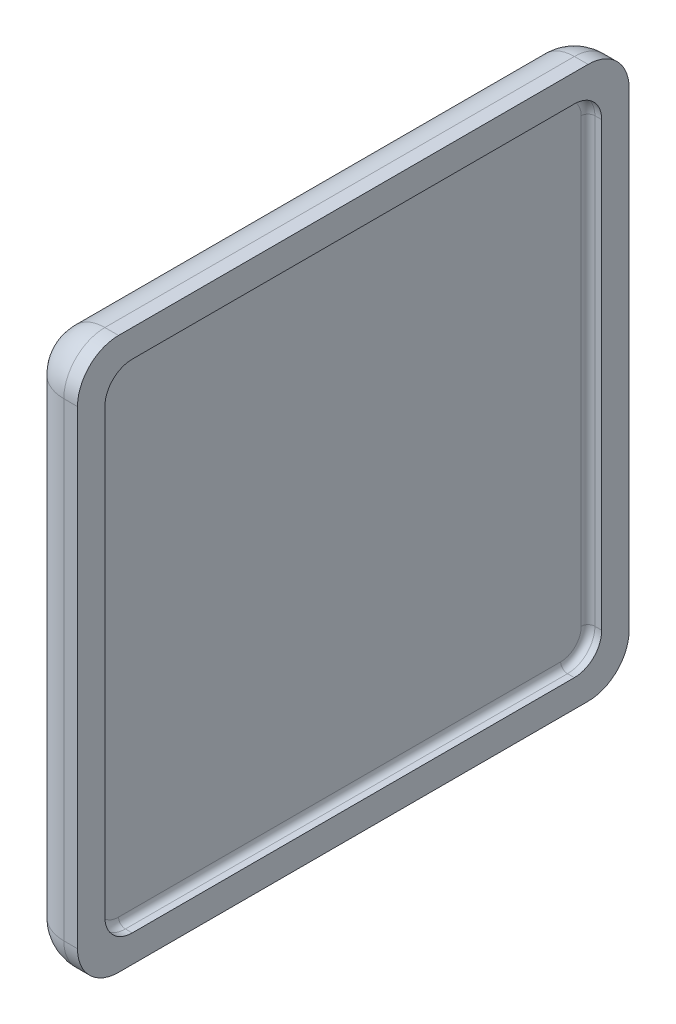
ISO-10303-21;
HEADER;
FILE_DESCRIPTION(('STEP AP214'),'2;1');
FILE_NAME('part.step','',(''),(''),'','','');
FILE_SCHEMA(('AUTOMOTIVE_DESIGN { 1 0 10303 214 1 1 1 1 }'));
ENDSEC;
DATA;
#1=APPLICATION_CONTEXT('core data for automotive mechanical design processes');
#2=APPLICATION_PROTOCOL_DEFINITION('international standard','automotive_design',2000,#1);
#3=PRODUCT_CONTEXT('',#1,'mechanical');
#4=PRODUCT('Part','Part','',(#3));
#5=PRODUCT_RELATED_PRODUCT_CATEGORY('part','',(#4));
#6=PRODUCT_DEFINITION_FORMATION('','',#4);
#7=PRODUCT_DEFINITION_CONTEXT('part definition',#1,'design');
#8=PRODUCT_DEFINITION('design','',#6,#7);
#9=PRODUCT_DEFINITION_SHAPE('','',#8);
#10=(LENGTH_UNIT() NAMED_UNIT(*) SI_UNIT(.MILLI.,.METRE.));
#11=(NAMED_UNIT(*) PLANE_ANGLE_UNIT() SI_UNIT($,.RADIAN.));
#12=(NAMED_UNIT(*) SI_UNIT($,.STERADIAN.) SOLID_ANGLE_UNIT());
#13=UNCERTAINTY_MEASURE_WITH_UNIT(LENGTH_MEASURE(1.E-05),#10,'distance_accuracy_value','');
#14=(GEOMETRIC_REPRESENTATION_CONTEXT(3) GLOBAL_UNCERTAINTY_ASSIGNED_CONTEXT((#13)) GLOBAL_UNIT_ASSIGNED_CONTEXT((#10,
#11,#12)) REPRESENTATION_CONTEXT('',''));
#15=CARTESIAN_POINT('',(0.,0.,0.));
#16=DIRECTION('',(0.,0.,1.));
#17=DIRECTION('',(1.,0.,0.));
#18=AXIS2_PLACEMENT_3D('',#15,#16,#17);
#19=CARTESIAN_POINT('',(-4.,0.,-1.136868E-13));
#20=DIRECTION('',(-1.,0.,0.));
#21=DIRECTION('',(0.,0.,1.));
#22=AXIS2_PLACEMENT_3D('',#19,#20,#21);
#23=PLANE('',#22);
#24=DIRECTION('',(0.,-1.,0.));
#25=VECTOR('',#24,1.);
#26=CARTESIAN_POINT('',(-4.,0.,-17.15));
#27=LINE('',#26,#25);
#28=CARTESIAN_POINT('',(-4.,-17.1499999999996,-17.15));
#29=VERTEX_POINT('',#28);
#30=CARTESIAN_POINT('',(-4.,17.1500000000005,-17.15));
#31=VERTEX_POINT('',#30);
#32=EDGE_CURVE('E434',#29,#31,#27,.F.);
#33=ORIENTED_EDGE('',*,*,#32,.F.);
#34=DIRECTION('',(0.,0.,1.));
#35=VECTOR('',#34,1.);
#36=CARTESIAN_POINT('',(-4.,-17.1499999999996,-1.1398555191E-13));
#37=LINE('',#36,#35);
#38=CARTESIAN_POINT('',(-4.00000000000009,-17.1499999999996,17.15));
#39=VERTEX_POINT('',#38);
#40=EDGE_CURVE('E431',#39,#29,#37,.F.);
#41=ORIENTED_EDGE('',*,*,#40,.F.);
#42=DIRECTION('',(0.,1.,0.));
#43=VECTOR('',#42,1.);
#44=CARTESIAN_POINT('',(-4.00000000000011,0.,17.15));
#45=LINE('',#44,#43);
#46=CARTESIAN_POINT('',(-4.00000000000009,17.1500000000005,17.15));
#47=VERTEX_POINT('',#46);
#48=EDGE_CURVE('E424',#47,#39,#45,.F.);
#49=ORIENTED_EDGE('',*,*,#48,.F.);
#50=DIRECTION('',(0.,0.,-1.));
#51=VECTOR('',#50,1.);
#52=CARTESIAN_POINT('',(-4.,17.1500000000005,-1.1398555191E-13));
#53=LINE('',#52,#51);
#54=EDGE_CURVE('E443',#31,#47,#53,.F.);
#55=ORIENTED_EDGE('',*,*,#54,.F.);
#56=EDGE_LOOP('',(#33,#41,#49,#55));
#57=FACE_BOUND('',#56,.T.);
#58=ADVANCED_FACE('F15',(#57),#23,.T.);
#59=CARTESIAN_POINT('',(-1.00000000000011,0.,17.15));
#60=DIRECTION('',(0.,1.,0.));
#61=DIRECTION('',(0.,0.,1.));
#62=AXIS2_PLACEMENT_3D('',#59,#60,#61);
#63=CYLINDRICAL_SURFACE('',#62,3.);
#64=DIRECTION('',(0.,1.,0.));
#65=VECTOR('',#64,1.);
#66=CARTESIAN_POINT('',(-1.00000000000011,0.,20.15));
#67=LINE('',#66,#65);
#68=CARTESIAN_POINT('',(-1.00000000000011,-17.1499999999996,20.15));
#69=VERTEX_POINT('',#68);
#70=CARTESIAN_POINT('',(-1.00000000000011,17.1500000000005,20.15));
#71=VERTEX_POINT('',#70);
#72=EDGE_CURVE('E185',#69,#71,#67,.T.);
#73=ORIENTED_EDGE('',*,*,#72,.T.);
#74=CARTESIAN_POINT('',(-1.00000000000011,17.1500000000005,17.15));
#75=DIRECTION('',(0.,-1.,0.));
#76=DIRECTION('',(1.,0.,0.));
#77=AXIS2_PLACEMENT_3D('',#74,#75,#76);
#78=CIRCLE('',#77,3.);
#79=EDGE_CURVE('E416',#47,#71,#78,.F.);
#80=ORIENTED_EDGE('',*,*,#79,.F.);
#81=ORIENTED_EDGE('',*,*,#48,.T.);
#82=CARTESIAN_POINT('',(-1.00000000000011,-17.1499999999996,17.15));
#83=DIRECTION('',(0.,-1.,0.));
#84=DIRECTION('',(1.,0.,0.));
#85=AXIS2_PLACEMENT_3D('',#82,#83,#84);
#86=CIRCLE('',#85,3.);
#87=EDGE_CURVE('E373',#69,#39,#86,.T.);
#88=ORIENTED_EDGE('',*,*,#87,.F.);
#89=EDGE_LOOP('',(#73,#80,#81,#88));
#90=FACE_BOUND('',#89,.T.);
#91=ADVANCED_FACE('F497',(#90),#63,.T.);
#92=CARTESIAN_POINT('',(-1.00000000000011,17.1500000000005,17.15));
#93=DIRECTION('',(1.,0.,0.));
#94=DIRECTION('',(0.,1.,0.));
#95=AXIS2_PLACEMENT_3D('',#92,#93,#94);
#96=SPHERICAL_SURFACE('',#95,3.);
#97=ORIENTED_EDGE('',*,*,#79,.T.);
#98=CARTESIAN_POINT('',(-1.00000000000011,17.1500000000005,17.15));
#99=DIRECTION('',(1.,0.,0.));
#100=DIRECTION('',(0.,0.,-1.));
#101=AXIS2_PLACEMENT_3D('',#98,#99,#100);
#102=CIRCLE('',#101,3.);
#103=CARTESIAN_POINT('',(-1.00000000000011,20.1500000000005,17.15));
#104=VERTEX_POINT('',#103);
#105=EDGE_CURVE('E359',#104,#71,#102,.T.);
#106=ORIENTED_EDGE('',*,*,#105,.F.);
#107=CARTESIAN_POINT('',(-1.,17.1500000000005,17.15));
#108=DIRECTION('',(0.,0.,-1.));
#109=DIRECTION('',(-1.,0.,0.));
#110=AXIS2_PLACEMENT_3D('',#107,#108,#109);
#111=CIRCLE('',#110,3.);
#112=EDGE_CURVE('E408',#47,#104,#111,.T.);
#113=ORIENTED_EDGE('',*,*,#112,.F.);
#114=EDGE_LOOP('',(#97,#106,#113));
#115=FACE_BOUND('',#114,.T.);
#116=ADVANCED_FACE('F499',(#115),#96,.T.);
#117=CARTESIAN_POINT('',(-1.,17.1500000000005,-1.136868E-13));
#118=DIRECTION('',(0.,0.,-1.));
#119=DIRECTION('',(-1.,0.,0.));
#120=AXIS2_PLACEMENT_3D('',#117,#118,#119);
#121=CYLINDRICAL_SURFACE('',#120,3.);
#122=DIRECTION('',(0.,0.,-1.));
#123=VECTOR('',#122,1.);
#124=CARTESIAN_POINT('',(-1.00000000000011,20.1500000000005,-1.136868E-13));
#125=LINE('',#124,#123);
#126=CARTESIAN_POINT('',(-1.00000000000003,20.1500000000005,-17.15));
#127=VERTEX_POINT('',#126);
#128=EDGE_CURVE('E355',#104,#127,#125,.T.);
#129=ORIENTED_EDGE('',*,*,#128,.T.);
#130=CARTESIAN_POINT('',(-1.,17.1500000000005,-17.15));
#131=DIRECTION('',(0.,0.,1.));
#132=DIRECTION('',(1.,0.,0.));
#133=AXIS2_PLACEMENT_3D('',#130,#131,#132);
#134=CIRCLE('',#133,3.);
#135=EDGE_CURVE('E396',#31,#127,#134,.F.);
#136=ORIENTED_EDGE('',*,*,#135,.F.);
#137=ORIENTED_EDGE('',*,*,#54,.T.);
#138=ORIENTED_EDGE('',*,*,#112,.T.);
#139=EDGE_LOOP('',(#129,#136,#137,#138));
#140=FACE_BOUND('',#139,.T.);
#141=ADVANCED_FACE('F472',(#140),#121,.T.);
#142=CARTESIAN_POINT('',(-1.,17.1500000000005,-17.15));
#143=DIRECTION('',(1.,0.,0.));
#144=DIRECTION('',(0.,1.,0.));
#145=AXIS2_PLACEMENT_3D('',#142,#143,#144);
#146=SPHERICAL_SURFACE('',#145,3.);
#147=CARTESIAN_POINT('',(-1.,17.1500000000005,-17.15));
#148=DIRECTION('',(1.,0.,0.));
#149=DIRECTION('',(0.,0.,-1.));
#150=AXIS2_PLACEMENT_3D('',#147,#148,#149);
#151=CIRCLE('',#150,3.);
#152=CARTESIAN_POINT('',(-1.,17.1500000000005,-20.15));
#153=VERTEX_POINT('',#152);
#154=EDGE_CURVE('E344',#153,#127,#151,.T.);
#155=ORIENTED_EDGE('',*,*,#154,.F.);
#156=CARTESIAN_POINT('',(-1.,17.1500000000005,-17.15));
#157=DIRECTION('',(0.,-1.,0.));
#158=DIRECTION('',(0.,0.,-1.));
#159=AXIS2_PLACEMENT_3D('',#156,#157,#158);
#160=CIRCLE('',#159,3.);
#161=EDGE_CURVE('E391',#31,#153,#160,.T.);
#162=ORIENTED_EDGE('',*,*,#161,.F.);
#163=ORIENTED_EDGE('',*,*,#135,.T.);
#164=EDGE_LOOP('',(#155,#162,#163));
#165=FACE_BOUND('',#164,.T.);
#166=ADVANCED_FACE('F474',(#165),#146,.T.);
#167=CARTESIAN_POINT('',(-1.,0.,-17.15));
#168=DIRECTION('',(0.,-1.,0.));
#169=DIRECTION('',(0.,0.,-1.));
#170=AXIS2_PLACEMENT_3D('',#167,#168,#169);
#171=CYLINDRICAL_SURFACE('',#170,3.);
#172=DIRECTION('',(0.,1.,0.));
#173=VECTOR('',#172,1.);
#174=CARTESIAN_POINT('',(-1.,0.,-20.15));
#175=LINE('',#174,#173);
#176=CARTESIAN_POINT('',(-1.,-17.1499999999996,-20.15));
#177=VERTEX_POINT('',#176);
#178=EDGE_CURVE('E338',#153,#177,#175,.F.);
#179=ORIENTED_EDGE('',*,*,#178,.T.);
#180=CARTESIAN_POINT('',(-1.,-17.1499999999996,-17.15));
#181=DIRECTION('',(0.,1.,0.));
#182=DIRECTION('',(1.,0.,0.));
#183=AXIS2_PLACEMENT_3D('',#180,#181,#182);
#184=CIRCLE('',#183,3.);
#185=EDGE_CURVE('E379',#29,#177,#184,.F.);
#186=ORIENTED_EDGE('',*,*,#185,.F.);
#187=ORIENTED_EDGE('',*,*,#32,.T.);
#188=ORIENTED_EDGE('',*,*,#161,.T.);
#189=EDGE_LOOP('',(#179,#186,#187,#188));
#190=FACE_BOUND('',#189,.T.);
#191=ADVANCED_FACE('F482',(#190),#171,.T.);
#192=CARTESIAN_POINT('',(-1.,-17.1499999999996,-17.15));
#193=DIRECTION('',(1.,0.,0.));
#194=DIRECTION('',(0.,1.,0.));
#195=AXIS2_PLACEMENT_3D('',#192,#193,#194);
#196=SPHERICAL_SURFACE('',#195,3.);
#197=CARTESIAN_POINT('',(-0.999999999999998,-17.1499999999996,-17.15));
#198=DIRECTION('',(0.,0.,1.));
#199=DIRECTION('',(1.,0.,0.));
#200=AXIS2_PLACEMENT_3D('',#197,#198,#199);
#201=CIRCLE('',#200,3.);
#202=CARTESIAN_POINT('',(-1.,-20.1499999999996,-17.15));
#203=VERTEX_POINT('',#202);
#204=EDGE_CURVE('E374',#29,#203,#201,.T.);
#205=ORIENTED_EDGE('',*,*,#204,.F.);
#206=ORIENTED_EDGE('',*,*,#185,.T.);
#207=CARTESIAN_POINT('',(-1.,-17.1499999999996,-17.15));
#208=DIRECTION('',(1.,0.,0.));
#209=DIRECTION('',(0.,0.,-1.));
#210=AXIS2_PLACEMENT_3D('',#207,#208,#209);
#211=CIRCLE('',#210,3.);
#212=EDGE_CURVE('E332',#203,#177,#211,.T.);
#213=ORIENTED_EDGE('',*,*,#212,.F.);
#214=EDGE_LOOP('',(#205,#206,#213));
#215=FACE_BOUND('',#214,.T.);
#216=ADVANCED_FACE('F486',(#215),#196,.T.);
#217=CARTESIAN_POINT('',(-1.,-17.1499999999996,-1.136868E-13));
#218=DIRECTION('',(0.,0.,1.));
#219=DIRECTION('',(1.,0.,0.));
#220=AXIS2_PLACEMENT_3D('',#217,#218,#219);
#221=CYLINDRICAL_SURFACE('',#220,3.);
#222=DIRECTION('',(0.,0.,1.));
#223=VECTOR('',#222,1.);
#224=CARTESIAN_POINT('',(-1.,-20.1499999999996,-1.136868E-13));
#225=LINE('',#224,#223);
#226=CARTESIAN_POINT('',(-1.00000000000009,-20.1499999999996,17.15));
#227=VERTEX_POINT('',#226);
#228=EDGE_CURVE('E331',#203,#227,#225,.T.);
#229=ORIENTED_EDGE('',*,*,#228,.T.);
#230=CARTESIAN_POINT('',(-1.00000000000011,-17.1499999999996,17.15));
#231=DIRECTION('',(0.,0.,-1.));
#232=DIRECTION('',(1.,0.,0.));
#233=AXIS2_PLACEMENT_3D('',#230,#231,#232);
#234=CIRCLE('',#233,3.);
#235=EDGE_CURVE('E370',#39,#227,#234,.F.);
#236=ORIENTED_EDGE('',*,*,#235,.F.);
#237=ORIENTED_EDGE('',*,*,#40,.T.);
#238=ORIENTED_EDGE('',*,*,#204,.T.);
#239=EDGE_LOOP('',(#229,#236,#237,#238));
#240=FACE_BOUND('',#239,.T.);
#241=ADVANCED_FACE('F489',(#240),#221,.T.);
#242=CARTESIAN_POINT('',(-1.00000000000011,-17.1499999999996,17.15));
#243=DIRECTION('',(1.,0.,0.));
#244=DIRECTION('',(0.,1.,0.));
#245=AXIS2_PLACEMENT_3D('',#242,#243,#244);
#246=SPHERICAL_SURFACE('',#245,3.);
#247=CARTESIAN_POINT('',(-1.00000000000011,-17.1499999999996,17.15));
#248=DIRECTION('',(1.,0.,0.));
#249=DIRECTION('',(0.,0.,-1.));
#250=AXIS2_PLACEMENT_3D('',#247,#248,#249);
#251=CIRCLE('',#250,3.);
#252=EDGE_CURVE('E191',#69,#227,#251,.T.);
#253=ORIENTED_EDGE('',*,*,#252,.F.);
#254=ORIENTED_EDGE('',*,*,#87,.T.);
#255=ORIENTED_EDGE('',*,*,#235,.T.);
#256=EDGE_LOOP('',(#253,#254,#255));
#257=FACE_BOUND('',#256,.T.);
#258=ADVANCED_FACE('F495',(#257),#246,.T.);
#259=CARTESIAN_POINT('',(-2.00000000000011,0.,20.15));
#260=DIRECTION('',(0.,0.,-1.));
#261=DIRECTION('',(-1.,0.,0.));
#262=AXIS2_PLACEMENT_3D('',#259,#260,#261);
#263=PLANE('',#262);
#264=DIRECTION('',(0.,1.,0.));
#265=VECTOR('',#264,1.);
#266=CARTESIAN_POINT('',(0.,0.,20.15));
#267=LINE('',#266,#265);
#268=CARTESIAN_POINT('',(0.,-17.1499999999996,20.15));
#269=VERTEX_POINT('',#268);
#270=CARTESIAN_POINT('',(0.,17.1500000000005,20.15));
#271=VERTEX_POINT('',#270);
#272=EDGE_CURVE('E182',#269,#271,#267,.T.);
#273=ORIENTED_EDGE('',*,*,#272,.T.);
#274=DIRECTION('',(1.,0.,0.));
#275=VECTOR('',#274,1.);
#276=CARTESIAN_POINT('',(-2.00000000000011,17.1500000000005,20.15));
#277=LINE('',#276,#275);
#278=EDGE_CURVE('E186',#71,#271,#277,.T.);
#279=ORIENTED_EDGE('',*,*,#278,.F.);
#280=ORIENTED_EDGE('',*,*,#72,.F.);
#281=DIRECTION('',(-1.,0.,0.));
#282=VECTOR('',#281,1.);
#283=CARTESIAN_POINT('',(-2.00000000000011,-17.1499999999996,20.15));
#284=LINE('',#283,#282);
#285=EDGE_CURVE('E171',#269,#69,#284,.T.);
#286=ORIENTED_EDGE('',*,*,#285,.F.);
#287=EDGE_LOOP('',(#273,#279,#280,#286));
#288=FACE_BOUND('',#287,.T.);
#289=ADVANCED_FACE('F180',(#288),#263,.F.);
#290=CARTESIAN_POINT('',(-2.00000000000011,17.1500000000005,17.15));
#291=DIRECTION('',(1.,0.,0.));
#292=DIRECTION('',(0.,0.,-1.));
#293=AXIS2_PLACEMENT_3D('',#290,#291,#292);
#294=CYLINDRICAL_SURFACE('',#293,3.);
#295=DIRECTION('',(1.,0.,0.));
#296=VECTOR('',#295,1.);
#297=CARTESIAN_POINT('',(-2.,20.1500000000005,17.15));
#298=LINE('',#297,#296);
#299=CARTESIAN_POINT('',(0.,20.1500000000005,17.15));
#300=VERTEX_POINT('',#299);
#301=EDGE_CURVE('E350',#300,#104,#298,.F.);
#302=ORIENTED_EDGE('',*,*,#301,.T.);
#303=ORIENTED_EDGE('',*,*,#105,.T.);
#304=ORIENTED_EDGE('',*,*,#278,.T.);
#305=CARTESIAN_POINT('',(-1.14058068545475E-13,17.1500000000005,17.15));
#306=DIRECTION('',(1.,0.,0.));
#307=DIRECTION('',(0.,0.,-1.));
#308=AXIS2_PLACEMENT_3D('',#305,#306,#307);
#309=CIRCLE('',#308,3.);
#310=EDGE_CURVE('E20',#271,#300,#309,.F.);
#311=ORIENTED_EDGE('',*,*,#310,.T.);
#312=EDGE_LOOP('',(#302,#303,#304,#311));
#313=FACE_BOUND('',#312,.T.);
#314=ADVANCED_FACE('F501',(#313),#294,.T.);
#315=CARTESIAN_POINT('',(-2.,20.1500000000005,-1.136868E-13));
#316=DIRECTION('',(0.,-1.,0.));
#317=DIRECTION('',(0.,0.,-1.));
#318=AXIS2_PLACEMENT_3D('',#315,#316,#317);
#319=PLANE('',#318);
#320=DIRECTION('',(0.,0.,1.));
#321=VECTOR('',#320,1.);
#322=CARTESIAN_POINT('',(0.,20.1500000000005,-1.136868E-13));
#323=LINE('',#322,#321);
#324=CARTESIAN_POINT('',(0.,20.1500000000005,-17.15));
#325=VERTEX_POINT('',#324);
#326=EDGE_CURVE('E190',#300,#325,#323,.F.);
#327=ORIENTED_EDGE('',*,*,#326,.T.);
#328=DIRECTION('',(1.,0.,0.));
#329=VECTOR('',#328,1.);
#330=CARTESIAN_POINT('',(-2.,20.1500000000005,-17.15));
#331=LINE('',#330,#329);
#332=EDGE_CURVE('E347',#127,#325,#331,.T.);
#333=ORIENTED_EDGE('',*,*,#332,.F.);
#334=ORIENTED_EDGE('',*,*,#128,.F.);
#335=ORIENTED_EDGE('',*,*,#301,.F.);
#336=EDGE_LOOP('',(#327,#333,#334,#335));
#337=FACE_BOUND('',#336,.T.);
#338=ADVANCED_FACE('F466',(#337),#319,.F.);
#339=CARTESIAN_POINT('',(-2.,17.1500000000005,-17.15));
#340=DIRECTION('',(1.,0.,0.));
#341=DIRECTION('',(0.,0.,-1.));
#342=AXIS2_PLACEMENT_3D('',#339,#340,#341);
#343=CYLINDRICAL_SURFACE('',#342,3.);
#344=DIRECTION('',(1.,0.,0.));
#345=VECTOR('',#344,1.);
#346=CARTESIAN_POINT('',(-2.,17.1500000000005,-20.15));
#347=LINE('',#346,#345);
#348=CARTESIAN_POINT('',(0.,17.1500000000005,-20.15));
#349=VERTEX_POINT('',#348);
#350=EDGE_CURVE('E341',#349,#153,#347,.F.);
#351=ORIENTED_EDGE('',*,*,#350,.T.);
#352=ORIENTED_EDGE('',*,*,#154,.T.);
#353=ORIENTED_EDGE('',*,*,#332,.T.);
#354=CARTESIAN_POINT('',(0.,17.1500000000005,-17.15));
#355=DIRECTION('',(1.,0.,0.));
#356=DIRECTION('',(0.,0.,-1.));
#357=AXIS2_PLACEMENT_3D('',#354,#355,#356);
#358=CIRCLE('',#357,3.);
#359=EDGE_CURVE('E458',#325,#349,#358,.F.);
#360=ORIENTED_EDGE('',*,*,#359,.T.);
#361=EDGE_LOOP('',(#351,#352,#353,#360));
#362=FACE_BOUND('',#361,.T.);
#363=ADVANCED_FACE('F468',(#362),#343,.T.);
#364=CARTESIAN_POINT('',(-2.,0.,-20.15));
#365=DIRECTION('',(0.,0.,1.));
#366=DIRECTION('',(1.,0.,0.));
#367=AXIS2_PLACEMENT_3D('',#364,#365,#366);
#368=PLANE('',#367);
#369=ORIENTED_EDGE('',*,*,#178,.F.);
#370=ORIENTED_EDGE('',*,*,#350,.F.);
#371=DIRECTION('',(0.,1.,0.));
#372=VECTOR('',#371,1.);
#373=CARTESIAN_POINT('',(0.,0.,-20.15));
#374=LINE('',#373,#372);
#375=CARTESIAN_POINT('',(0.,-17.1499999999996,-20.15));
#376=VERTEX_POINT('',#375);
#377=EDGE_CURVE('E457',#349,#376,#374,.F.);
#378=ORIENTED_EDGE('',*,*,#377,.T.);
#379=DIRECTION('',(1.,0.,0.));
#380=VECTOR('',#379,1.);
#381=CARTESIAN_POINT('',(-2.,-17.1499999999996,-20.15));
#382=LINE('',#381,#380);
#383=EDGE_CURVE('E335',#177,#376,#382,.T.);
#384=ORIENTED_EDGE('',*,*,#383,.F.);
#385=EDGE_LOOP('',(#369,#370,#378,#384));
#386=FACE_BOUND('',#385,.T.);
#387=ADVANCED_FACE('F784',(#386),#368,.F.);
#388=CARTESIAN_POINT('',(-2.,-17.1499999999996,-17.15));
#389=DIRECTION('',(1.,0.,0.));
#390=DIRECTION('',(0.,0.,-1.));
#391=AXIS2_PLACEMENT_3D('',#388,#389,#390);
#392=CYLINDRICAL_SURFACE('',#391,3.);
#393=DIRECTION('',(1.,0.,0.));
#394=VECTOR('',#393,1.);
#395=CARTESIAN_POINT('',(-2.,-20.1499999999996,-17.15));
#396=LINE('',#395,#394);
#397=CARTESIAN_POINT('',(0.,-20.1499999999996,-17.15));
#398=VERTEX_POINT('',#397);
#399=EDGE_CURVE('E328',#398,#203,#396,.F.);
#400=ORIENTED_EDGE('',*,*,#399,.T.);
#401=ORIENTED_EDGE('',*,*,#212,.T.);
#402=ORIENTED_EDGE('',*,*,#383,.T.);
#403=CARTESIAN_POINT('',(0.,-17.1499999999996,-17.15));
#404=DIRECTION('',(1.,0.,0.));
#405=DIRECTION('',(0.,0.,-1.));
#406=AXIS2_PLACEMENT_3D('',#403,#404,#405);
#407=CIRCLE('',#406,3.);
#408=EDGE_CURVE('E456',#376,#398,#407,.F.);
#409=ORIENTED_EDGE('',*,*,#408,.T.);
#410=EDGE_LOOP('',(#400,#401,#402,#409));
#411=FACE_BOUND('',#410,.T.);
#412=ADVANCED_FACE('F794',(#411),#392,.T.);
#413=CARTESIAN_POINT('',(-2.,-20.1499999999996,-1.136868E-13));
#414=DIRECTION('',(0.,1.,0.));
#415=DIRECTION('',(0.,0.,1.));
#416=AXIS2_PLACEMENT_3D('',#413,#414,#415);
#417=PLANE('',#416);
#418=ORIENTED_EDGE('',*,*,#228,.F.);
#419=ORIENTED_EDGE('',*,*,#399,.F.);
#420=DIRECTION('',(0.,0.,1.));
#421=VECTOR('',#420,1.);
#422=CARTESIAN_POINT('',(0.,-20.1499999999996,-1.136868E-13));
#423=LINE('',#422,#421);
#424=CARTESIAN_POINT('',(0.,-20.1499999999996,17.15));
#425=VERTEX_POINT('',#424);
#426=EDGE_CURVE('E177',#398,#425,#423,.T.);
#427=ORIENTED_EDGE('',*,*,#426,.T.);
#428=DIRECTION('',(1.,0.,0.));
#429=VECTOR('',#428,1.);
#430=CARTESIAN_POINT('',(-2.00000000000011,-20.1499999999996,17.15));
#431=LINE('',#430,#429);
#432=EDGE_CURVE('E174',#227,#425,#431,.T.);
#433=ORIENTED_EDGE('',*,*,#432,.F.);
#434=EDGE_LOOP('',(#418,#419,#427,#433));
#435=FACE_BOUND('',#434,.T.);
#436=ADVANCED_FACE('F492',(#435),#417,.F.);
#437=CARTESIAN_POINT('',(-2.00000000000011,-17.1499999999996,17.15));
#438=DIRECTION('',(1.,0.,0.));
#439=DIRECTION('',(0.,0.,-1.));
#440=AXIS2_PLACEMENT_3D('',#437,#438,#439);
#441=CYLINDRICAL_SURFACE('',#440,3.);
#442=ORIENTED_EDGE('',*,*,#432,.T.);
#443=CARTESIAN_POINT('',(-1.13624387676481E-13,-17.1499999999996,17.15));
#444=DIRECTION('',(1.,0.,0.));
#445=DIRECTION('',(0.,0.,-1.));
#446=AXIS2_PLACEMENT_3D('',#443,#444,#445);
#447=CIRCLE('',#446,3.);
#448=EDGE_CURVE('E167',#425,#269,#447,.F.);
#449=ORIENTED_EDGE('',*,*,#448,.T.);
#450=ORIENTED_EDGE('',*,*,#285,.T.);
#451=ORIENTED_EDGE('',*,*,#252,.T.);
#452=EDGE_LOOP('',(#442,#449,#450,#451));
#453=FACE_BOUND('',#452,.T.);
#454=ADVANCED_FACE('F169',(#453),#441,.T.);
#455=CARTESIAN_POINT('',(0.,0.,-1.136868E-13));
#456=DIRECTION('',(-1.,0.,0.));
#457=DIRECTION('',(0.,0.,1.));
#458=AXIS2_PLACEMENT_3D('',#455,#456,#457);
#459=PLANE('',#458);
#460=CARTESIAN_POINT('',(0.,-16.1499999999996,-16.15));
#461=DIRECTION('',(-1.,0.,0.));
#462=DIRECTION('',(0.,0.,1.));
#463=AXIS2_PLACEMENT_3D('',#460,#461,#462);
#464=CIRCLE('',#463,2.);
#465=CARTESIAN_POINT('',(0.,-18.1499999999996,-16.15));
#466=VERTEX_POINT('',#465);
#467=CARTESIAN_POINT('',(0.,-16.1499999999996,-18.15));
#468=VERTEX_POINT('',#467);
#469=EDGE_CURVE('E317',#466,#468,#464,.F.);
#470=ORIENTED_EDGE('',*,*,#469,.F.);
#471=DIRECTION('',(0.,0.,-1.));
#472=VECTOR('',#471,1.);
#473=CARTESIAN_POINT('',(0.,-18.1499999999996,16.15));
#474=LINE('',#473,#472);
#475=CARTESIAN_POINT('',(0.,-18.1499999999996,16.15));
#476=VERTEX_POINT('',#475);
#477=EDGE_CURVE('E279',#466,#476,#474,.F.);
#478=ORIENTED_EDGE('',*,*,#477,.T.);
#479=CARTESIAN_POINT('',(-1.136868E-13,-16.1499999999996,16.15));
#480=DIRECTION('',(-1.,0.,0.));
#481=DIRECTION('',(0.,0.,1.));
#482=AXIS2_PLACEMENT_3D('',#479,#480,#481);
#483=CIRCLE('',#482,2.);
#484=CARTESIAN_POINT('',(-1.13724232120688E-13,-16.1499999999996,18.15));
#485=VERTEX_POINT('',#484);
#486=EDGE_CURVE('E451',#485,#476,#483,.F.);
#487=ORIENTED_EDGE('',*,*,#486,.F.);
#488=DIRECTION('',(0.,1.,0.));
#489=VECTOR('',#488,1.);
#490=CARTESIAN_POINT('',(-1.136868E-13,16.1500000000005,18.15));
#491=LINE('',#490,#489);
#492=CARTESIAN_POINT('',(-1.136868E-13,16.1500000000005,18.15));
#493=VERTEX_POINT('',#492);
#494=EDGE_CURVE('E311',#485,#493,#491,.T.);
#495=ORIENTED_EDGE('',*,*,#494,.T.);
#496=CARTESIAN_POINT('',(-1.139317212E-13,16.1500000000005,16.15));
#497=DIRECTION('',(-1.,0.,0.));
#498=DIRECTION('',(0.,0.,1.));
#499=AXIS2_PLACEMENT_3D('',#496,#497,#498);
#500=CIRCLE('',#499,2.);
#501=CARTESIAN_POINT('',(-1.13846692720688E-13,18.1500000000005,16.15));
#502=VERTEX_POINT('',#501);
#503=EDGE_CURVE('E453',#502,#493,#500,.F.);
#504=ORIENTED_EDGE('',*,*,#503,.F.);
#505=DIRECTION('',(0.,0.,1.));
#506=VECTOR('',#505,1.);
#507=CARTESIAN_POINT('',(-1.136868E-13,18.1500000000005,-16.15));
#508=LINE('',#507,#506);
#509=CARTESIAN_POINT('',(0.,18.1500000000005,-16.15));
#510=VERTEX_POINT('',#509);
#511=EDGE_CURVE('E263',#502,#510,#508,.F.);
#512=ORIENTED_EDGE('',*,*,#511,.T.);
#513=CARTESIAN_POINT('',(0.,16.1500000000005,-16.15));
#514=DIRECTION('',(-1.,0.,0.));
#515=DIRECTION('',(0.,0.,1.));
#516=AXIS2_PLACEMENT_3D('',#513,#514,#515);
#517=CIRCLE('',#516,2.);
#518=CARTESIAN_POINT('',(0.,16.1500000000005,-18.15));
#519=VERTEX_POINT('',#518);
#520=EDGE_CURVE('E176',#519,#510,#517,.F.);
#521=ORIENTED_EDGE('',*,*,#520,.F.);
#522=DIRECTION('',(0.,1.,0.));
#523=VECTOR('',#522,1.);
#524=CARTESIAN_POINT('',(0.,-16.1499999999996,-18.15));
#525=LINE('',#524,#523);
#526=EDGE_CURVE('E264',#519,#468,#525,.F.);
#527=ORIENTED_EDGE('',*,*,#526,.T.);
#528=EDGE_LOOP('',(#470,#478,#487,#495,#504,#512,#521,#527));
#529=FACE_BOUND('',#528,.T.);
#530=ORIENTED_EDGE('',*,*,#426,.F.);
#531=ORIENTED_EDGE('',*,*,#408,.F.);
#532=ORIENTED_EDGE('',*,*,#377,.F.);
#533=ORIENTED_EDGE('',*,*,#359,.F.);
#534=ORIENTED_EDGE('',*,*,#326,.F.);
#535=ORIENTED_EDGE('',*,*,#310,.F.);
#536=ORIENTED_EDGE('',*,*,#272,.F.);
#537=ORIENTED_EDGE('',*,*,#448,.F.);
#538=EDGE_LOOP('',(#530,#531,#532,#533,#534,#535,#536,#537));
#539=FACE_BOUND('',#538,.T.);
#540=ADVANCED_FACE('F188',(#529,#539),#459,.F.);
#541=CARTESIAN_POINT('',(-1.136868E-13,16.1500000000005,18.15));
#542=DIRECTION('',(0.,0.,1.));
#543=DIRECTION('',(1.,0.,0.));
#544=AXIS2_PLACEMENT_3D('',#541,#542,#543);
#545=PLANE('',#544);
#546=DIRECTION('',(1.,0.,0.));
#547=VECTOR('',#546,1.);
#548=CARTESIAN_POINT('',(-1.136868E-13,16.1500000000005,18.15));
#549=LINE('',#548,#547);
#550=CARTESIAN_POINT('',(-0.500000000000114,16.1500000000005,18.15));
#551=VERTEX_POINT('',#550);
#552=EDGE_CURVE('E294',#493,#551,#549,.F.);
#553=ORIENTED_EDGE('',*,*,#552,.F.);
#554=ORIENTED_EDGE('',*,*,#494,.F.);
#555=DIRECTION('',(1.,0.,0.));
#556=VECTOR('',#555,1.);
#557=CARTESIAN_POINT('',(-1.136868E-13,-16.1499999999996,18.15));
#558=LINE('',#557,#556);
#559=CARTESIAN_POINT('',(-0.500000000000114,-16.1499999999996,18.15));
#560=VERTEX_POINT('',#559);
#561=EDGE_CURVE('E314',#560,#485,#558,.T.);
#562=ORIENTED_EDGE('',*,*,#561,.F.);
#563=DIRECTION('',(0.,-1.,0.));
#564=VECTOR('',#563,1.);
#565=CARTESIAN_POINT('',(-0.500000000000114,8.07499999999982,18.15));
#566=LINE('',#565,#564);
#567=EDGE_CURVE('E257',#560,#551,#566,.F.);
#568=ORIENTED_EDGE('',*,*,#567,.T.);
#569=EDGE_LOOP('',(#553,#554,#562,#568));
#570=FACE_BOUND('',#569,.T.);
#571=ADVANCED_FACE('F683',(#570),#545,.F.);
#572=CARTESIAN_POINT('',(-1.136868E-13,-18.1499999999996,16.15));
#573=DIRECTION('',(0.,-1.,0.));
#574=DIRECTION('',(0.,0.,-1.));
#575=AXIS2_PLACEMENT_3D('',#572,#573,#574);
#576=PLANE('',#575);
#577=DIRECTION('',(-1.,0.,0.));
#578=VECTOR('',#577,1.);
#579=CARTESIAN_POINT('',(-1.136868E-13,-18.1499999999996,16.15));
#580=LINE('',#579,#578);
#581=CARTESIAN_POINT('',(-0.500000000000086,-18.1499999999996,16.15));
#582=VERTEX_POINT('',#581);
#583=EDGE_CURVE('E252',#582,#476,#580,.F.);
#584=ORIENTED_EDGE('',*,*,#583,.T.);
#585=ORIENTED_EDGE('',*,*,#477,.F.);
#586=DIRECTION('',(1.,0.,0.));
#587=VECTOR('',#586,1.);
#588=CARTESIAN_POINT('',(-1.136868E-13,-18.1499999999996,-16.15));
#589=LINE('',#588,#587);
#590=CARTESIAN_POINT('',(-0.5,-18.1499999999996,-16.15));
#591=VERTEX_POINT('',#590);
#592=EDGE_CURVE('E291',#591,#466,#589,.T.);
#593=ORIENTED_EDGE('',*,*,#592,.F.);
#594=DIRECTION('',(0.,0.,-1.));
#595=VECTOR('',#594,1.);
#596=CARTESIAN_POINT('',(-0.500000000000003,-18.1499999999996,8.07499999999993));
#597=LINE('',#596,#595);
#598=EDGE_CURVE('E247',#591,#582,#597,.F.);
#599=ORIENTED_EDGE('',*,*,#598,.T.);
#600=EDGE_LOOP('',(#584,#585,#593,#599));
#601=FACE_BOUND('',#600,.T.);
#602=ADVANCED_FACE('F644',(#601),#576,.F.);
#603=CARTESIAN_POINT('',(0.,-16.1499999999996,-18.15));
#604=DIRECTION('',(0.,0.,-1.));
#605=DIRECTION('',(-1.,0.,0.));
#606=AXIS2_PLACEMENT_3D('',#603,#604,#605);
#607=PLANE('',#606);
#608=DIRECTION('',(-1.,0.,0.));
#609=VECTOR('',#608,1.);
#610=CARTESIAN_POINT('',(0.,-16.1499999999996,-18.15));
#611=LINE('',#610,#609);
#612=CARTESIAN_POINT('',(-0.5,-16.1499999999996,-18.15));
#613=VERTEX_POINT('',#612);
#614=EDGE_CURVE('E242',#613,#468,#611,.F.);
#615=ORIENTED_EDGE('',*,*,#614,.T.);
#616=ORIENTED_EDGE('',*,*,#526,.F.);
#617=DIRECTION('',(-1.,0.,0.));
#618=VECTOR('',#617,1.);
#619=CARTESIAN_POINT('',(0.,16.1500000000005,-18.15));
#620=LINE('',#619,#618);
#621=CARTESIAN_POINT('',(-0.5,16.1500000000005,-18.15));
#622=VERTEX_POINT('',#621);
#623=EDGE_CURVE('E276',#622,#519,#620,.F.);
#624=ORIENTED_EDGE('',*,*,#623,.F.);
#625=DIRECTION('',(0.,1.,0.));
#626=VECTOR('',#625,1.);
#627=CARTESIAN_POINT('',(-0.5,-8.07499999999982,-18.15));
#628=LINE('',#627,#626);
#629=EDGE_CURVE('E237',#622,#613,#628,.F.);
#630=ORIENTED_EDGE('',*,*,#629,.T.);
#631=EDGE_LOOP('',(#615,#616,#624,#630));
#632=FACE_BOUND('',#631,.T.);
#633=ADVANCED_FACE('F658',(#632),#607,.F.);
#634=CARTESIAN_POINT('',(0.,18.1500000000005,-16.15));
#635=DIRECTION('',(0.,1.,0.));
#636=DIRECTION('',(0.,0.,1.));
#637=AXIS2_PLACEMENT_3D('',#634,#635,#636);
#638=PLANE('',#637);
#639=DIRECTION('',(-1.,0.,0.));
#640=VECTOR('',#639,1.);
#641=CARTESIAN_POINT('',(0.,18.1500000000005,-16.15));
#642=LINE('',#641,#640);
#643=CARTESIAN_POINT('',(-0.500000000000028,18.1500000000005,-16.15));
#644=VERTEX_POINT('',#643);
#645=EDGE_CURVE('E232',#644,#510,#642,.F.);
#646=ORIENTED_EDGE('',*,*,#645,.T.);
#647=ORIENTED_EDGE('',*,*,#511,.F.);
#648=DIRECTION('',(1.,0.,0.));
#649=VECTOR('',#648,1.);
#650=CARTESIAN_POINT('',(0.,18.1500000000005,16.15));
#651=LINE('',#650,#649);
#652=CARTESIAN_POINT('',(-0.500000000000114,18.1500000000005,16.15));
#653=VERTEX_POINT('',#652);
#654=EDGE_CURVE('E260',#653,#502,#651,.T.);
#655=ORIENTED_EDGE('',*,*,#654,.F.);
#656=DIRECTION('',(0.,0.,1.));
#657=VECTOR('',#656,1.);
#658=CARTESIAN_POINT('',(-0.500000000000112,18.1500000000005,-8.07500000000016));
#659=LINE('',#658,#657);
#660=EDGE_CURVE('E229',#653,#644,#659,.F.);
#661=ORIENTED_EDGE('',*,*,#660,.T.);
#662=EDGE_LOOP('',(#646,#647,#655,#661));
#663=FACE_BOUND('',#662,.T.);
#664=ADVANCED_FACE('F665',(#663),#638,.F.);
#665=CARTESIAN_POINT('',(-1.136868E-13,-16.1499999999996,16.15));
#666=DIRECTION('',(-1.,0.,0.));
#667=DIRECTION('',(0.,0.,1.));
#668=AXIS2_PLACEMENT_3D('',#665,#666,#667);
#669=CYLINDRICAL_SURFACE('',#668,2.);
#670=CARTESIAN_POINT('',(-0.500000000000114,-16.1499999999996,16.15));
#671=DIRECTION('',(1.,0.,0.));
#672=DIRECTION('',(0.,0.,-1.));
#673=AXIS2_PLACEMENT_3D('',#670,#671,#672);
#674=CIRCLE('',#673,2.);
#675=EDGE_CURVE('E226',#582,#560,#674,.F.);
#676=ORIENTED_EDGE('',*,*,#675,.T.);
#677=ORIENTED_EDGE('',*,*,#561,.T.);
#678=ORIENTED_EDGE('',*,*,#486,.T.);
#679=ORIENTED_EDGE('',*,*,#583,.F.);
#680=EDGE_LOOP('',(#676,#677,#678,#679));
#681=FACE_BOUND('',#680,.T.);
#682=ADVANCED_FACE('F647',(#681),#669,.F.);
#683=CARTESIAN_POINT('',(0.,-16.1499999999996,-16.15));
#684=DIRECTION('',(-1.,0.,0.));
#685=DIRECTION('',(0.,0.,1.));
#686=AXIS2_PLACEMENT_3D('',#683,#684,#685);
#687=CYLINDRICAL_SURFACE('',#686,2.);
#688=CARTESIAN_POINT('',(-0.5,-16.1499999999996,-16.15));
#689=DIRECTION('',(1.,0.,0.));
#690=DIRECTION('',(0.,0.,-1.));
#691=AXIS2_PLACEMENT_3D('',#688,#689,#690);
#692=CIRCLE('',#691,2.);
#693=EDGE_CURVE('E297',#613,#591,#692,.F.);
#694=ORIENTED_EDGE('',*,*,#693,.T.);
#695=ORIENTED_EDGE('',*,*,#592,.T.);
#696=ORIENTED_EDGE('',*,*,#469,.T.);
#697=ORIENTED_EDGE('',*,*,#614,.F.);
#698=EDGE_LOOP('',(#694,#695,#696,#697));
#699=FACE_BOUND('',#698,.T.);
#700=ADVANCED_FACE('F654',(#699),#687,.F.);
#701=CARTESIAN_POINT('',(0.,16.1500000000005,-16.15));
#702=DIRECTION('',(-1.,0.,0.));
#703=DIRECTION('',(0.,0.,1.));
#704=AXIS2_PLACEMENT_3D('',#701,#702,#703);
#705=CYLINDRICAL_SURFACE('',#704,2.);
#706=CARTESIAN_POINT('',(-0.5,16.1500000000005,-16.15));
#707=DIRECTION('',(1.,0.,0.));
#708=DIRECTION('',(0.,0.,-1.));
#709=AXIS2_PLACEMENT_3D('',#706,#707,#708);
#710=CIRCLE('',#709,2.);
#711=EDGE_CURVE('E282',#644,#622,#710,.F.);
#712=ORIENTED_EDGE('',*,*,#711,.T.);
#713=ORIENTED_EDGE('',*,*,#623,.T.);
#714=ORIENTED_EDGE('',*,*,#520,.T.);
#715=ORIENTED_EDGE('',*,*,#645,.F.);
#716=EDGE_LOOP('',(#712,#713,#714,#715));
#717=FACE_BOUND('',#716,.T.);
#718=ADVANCED_FACE('F660',(#717),#705,.F.);
#719=CARTESIAN_POINT('',(-1.136868E-13,16.1500000000005,16.15));
#720=DIRECTION('',(-1.,0.,0.));
#721=DIRECTION('',(0.,0.,1.));
#722=AXIS2_PLACEMENT_3D('',#719,#720,#721);
#723=CYLINDRICAL_SURFACE('',#722,2.);
#724=CARTESIAN_POINT('',(-0.500000000000114,16.1500000000005,16.15));
#725=DIRECTION('',(1.,0.,0.));
#726=DIRECTION('',(0.,0.,-1.));
#727=AXIS2_PLACEMENT_3D('',#724,#725,#726);
#728=CIRCLE('',#727,2.);
#729=EDGE_CURVE('E267',#551,#653,#728,.F.);
#730=ORIENTED_EDGE('',*,*,#729,.T.);
#731=ORIENTED_EDGE('',*,*,#654,.T.);
#732=ORIENTED_EDGE('',*,*,#503,.T.);
#733=ORIENTED_EDGE('',*,*,#552,.T.);
#734=EDGE_LOOP('',(#730,#731,#732,#733));
#735=FACE_BOUND('',#734,.T.);
#736=ADVANCED_FACE('F668',(#735),#723,.F.);
#737=CARTESIAN_POINT('',(-0.500000000000114,8.07499999999982,17.65));
#738=DIRECTION('',(0.,-1.,0.));
#739=DIRECTION('',(0.,0.,-1.));
#740=AXIS2_PLACEMENT_3D('',#737,#738,#739);
#741=CYLINDRICAL_SURFACE('',#740,0.5);
#742=CARTESIAN_POINT('',(-0.500000000000114,-16.1499999999996,17.65));
#743=DIRECTION('',(0.,-1.,0.));
#744=DIRECTION('',(0.,0.,1.));
#745=AXIS2_PLACEMENT_3D('',#742,#743,#744);
#746=CIRCLE('',#745,0.5);
#747=CARTESIAN_POINT('',(-1.00000000000006,-16.1499999999996,17.65));
#748=VERTEX_POINT('',#747);
#749=EDGE_CURVE('E218',#560,#748,#746,.T.);
#750=ORIENTED_EDGE('',*,*,#749,.T.);
#751=DIRECTION('',(0.,1.,0.));
#752=VECTOR('',#751,1.);
#753=CARTESIAN_POINT('',(-1.,0.,17.65));
#754=LINE('',#753,#752);
#755=CARTESIAN_POINT('',(-1.00000000000006,16.1500000000005,17.65));
#756=VERTEX_POINT('',#755);
#757=EDGE_CURVE('E270',#756,#748,#754,.F.);
#758=ORIENTED_EDGE('',*,*,#757,.F.);
#759=CARTESIAN_POINT('',(-0.500000000000114,16.1500000000005,17.65));
#760=DIRECTION('',(0.,-1.,0.));
#761=DIRECTION('',(0.,0.,1.));
#762=AXIS2_PLACEMENT_3D('',#759,#760,#761);
#763=CIRCLE('',#762,0.5);
#764=EDGE_CURVE('E271',#756,#551,#763,.F.);
#765=ORIENTED_EDGE('',*,*,#764,.T.);
#766=ORIENTED_EDGE('',*,*,#567,.F.);
#767=EDGE_LOOP('',(#750,#758,#765,#766));
#768=FACE_BOUND('',#767,.T.);
#769=ADVANCED_FACE('F207',(#768),#741,.F.);
#770=CARTESIAN_POINT('',(-0.500000000000114,-16.1499999999996,16.15));
#771=DIRECTION('',(1.,0.,0.));
#772=DIRECTION('',(0.,0.,-1.));
#773=AXIS2_PLACEMENT_3D('',#770,#771,#772);
#774=TOROIDAL_SURFACE('',#773,1.5,0.5);
#775=CARTESIAN_POINT('',(-1.00000000000011,-16.1499999999996,16.15));
#776=DIRECTION('',(-1.,0.,0.));
#777=DIRECTION('',(0.,-1.,0.));
#778=AXIS2_PLACEMENT_3D('',#775,#776,#777);
#779=CIRCLE('',#778,1.5);
#780=CARTESIAN_POINT('',(-1.00000000000006,-17.6499999999996,16.15));
#781=VERTEX_POINT('',#780);
#782=EDGE_CURVE('E543',#748,#781,#779,.F.);
#783=ORIENTED_EDGE('',*,*,#782,.F.);
#784=ORIENTED_EDGE('',*,*,#749,.F.);
#785=ORIENTED_EDGE('',*,*,#675,.F.);
#786=CARTESIAN_POINT('',(-0.500000000000115,-17.6499999999996,16.15));
#787=DIRECTION('',(0.,0.,-1.));
#788=DIRECTION('',(-1.,0.,0.));
#789=AXIS2_PLACEMENT_3D('',#786,#787,#788);
#790=CIRCLE('',#789,0.5);
#791=EDGE_CURVE('E225',#582,#781,#790,.T.);
#792=ORIENTED_EDGE('',*,*,#791,.T.);
#793=EDGE_LOOP('',(#783,#784,#785,#792));
#794=FACE_BOUND('',#793,.T.);
#795=ADVANCED_FACE('F201',(#794),#774,.F.);
#796=CARTESIAN_POINT('',(-0.500000000000114,-17.6499999999996,8.07499999999993));
#797=DIRECTION('',(0.,0.,-1.));
#798=DIRECTION('',(-1.,0.,0.));
#799=AXIS2_PLACEMENT_3D('',#796,#797,#798);
#800=CYLINDRICAL_SURFACE('',#799,0.5);
#801=CARTESIAN_POINT('',(-0.5,-17.6499999999996,-16.15));
#802=DIRECTION('',(0.,0.,-1.));
#803=DIRECTION('',(0.,-1.,0.));
#804=AXIS2_PLACEMENT_3D('',#801,#802,#803);
#805=CIRCLE('',#804,0.5);
#806=CARTESIAN_POINT('',(-1.,-17.6499999999996,-16.15));
#807=VERTEX_POINT('',#806);
#808=EDGE_CURVE('E300',#591,#807,#805,.T.);
#809=ORIENTED_EDGE('',*,*,#808,.T.);
#810=DIRECTION('',(0.,0.,-1.));
#811=VECTOR('',#810,1.);
#812=CARTESIAN_POINT('',(-1.,-17.6499999999996,-1.136868E-13));
#813=LINE('',#812,#811);
#814=EDGE_CURVE('E540',#781,#807,#813,.T.);
#815=ORIENTED_EDGE('',*,*,#814,.F.);
#816=ORIENTED_EDGE('',*,*,#791,.F.);
#817=ORIENTED_EDGE('',*,*,#598,.F.);
#818=EDGE_LOOP('',(#809,#815,#816,#817));
#819=FACE_BOUND('',#818,.T.);
#820=ADVANCED_FACE('F206',(#819),#800,.F.);
#821=CARTESIAN_POINT('',(-0.5,-16.1499999999996,-16.15));
#822=DIRECTION('',(1.,0.,0.));
#823=DIRECTION('',(0.,0.,-1.));
#824=AXIS2_PLACEMENT_3D('',#821,#822,#823);
#825=TOROIDAL_SURFACE('',#824,1.5,0.5);
#826=CARTESIAN_POINT('',(-1.,-16.1499999999996,-16.15));
#827=DIRECTION('',(-1.,0.,0.));
#828=DIRECTION('',(0.,0.,-1.));
#829=AXIS2_PLACEMENT_3D('',#826,#827,#828);
#830=CIRCLE('',#829,1.5);
#831=CARTESIAN_POINT('',(-1.,-16.1499999999996,-17.65));
#832=VERTEX_POINT('',#831);
#833=EDGE_CURVE('E537',#807,#832,#830,.F.);
#834=ORIENTED_EDGE('',*,*,#833,.F.);
#835=ORIENTED_EDGE('',*,*,#808,.F.);
#836=ORIENTED_EDGE('',*,*,#693,.F.);
#837=CARTESIAN_POINT('',(-0.5,-16.1499999999996,-17.65));
#838=DIRECTION('',(0.,1.,0.));
#839=DIRECTION('',(0.,0.,1.));
#840=AXIS2_PLACEMENT_3D('',#837,#838,#839);
#841=CIRCLE('',#840,0.5);
#842=EDGE_CURVE('E601',#613,#832,#841,.T.);
#843=ORIENTED_EDGE('',*,*,#842,.T.);
#844=EDGE_LOOP('',(#834,#835,#836,#843));
#845=FACE_BOUND('',#844,.T.);
#846=ADVANCED_FACE('F599',(#845),#825,.F.);
#847=CARTESIAN_POINT('',(-0.5,-8.07499999999982,-17.65));
#848=DIRECTION('',(0.,1.,0.));
#849=DIRECTION('',(0.,0.,1.));
#850=AXIS2_PLACEMENT_3D('',#847,#848,#849);
#851=CYLINDRICAL_SURFACE('',#850,0.5);
#852=CARTESIAN_POINT('',(-0.5,16.1500000000005,-17.65));
#853=DIRECTION('',(0.,1.,0.));
#854=DIRECTION('',(0.,0.,-1.));
#855=AXIS2_PLACEMENT_3D('',#852,#853,#854);
#856=CIRCLE('',#855,0.5);
#857=CARTESIAN_POINT('',(-1.,16.1500000000005,-17.65));
#858=VERTEX_POINT('',#857);
#859=EDGE_CURVE('E286',#622,#858,#856,.T.);
#860=ORIENTED_EDGE('',*,*,#859,.T.);
#861=DIRECTION('',(0.,1.,0.));
#862=VECTOR('',#861,1.);
#863=CARTESIAN_POINT('',(-1.,0.,-17.65));
#864=LINE('',#863,#862);
#865=EDGE_CURVE('E529',#832,#858,#864,.T.);
#866=ORIENTED_EDGE('',*,*,#865,.F.);
#867=ORIENTED_EDGE('',*,*,#842,.F.);
#868=ORIENTED_EDGE('',*,*,#629,.F.);
#869=EDGE_LOOP('',(#860,#866,#867,#868));
#870=FACE_BOUND('',#869,.T.);
#871=ADVANCED_FACE('F618',(#870),#851,.F.);
#872=CARTESIAN_POINT('',(-0.5,16.1500000000005,-16.15));
#873=DIRECTION('',(1.,0.,0.));
#874=DIRECTION('',(0.,0.,-1.));
#875=AXIS2_PLACEMENT_3D('',#872,#873,#874);
#876=TOROIDAL_SURFACE('',#875,1.5,0.5);
#877=ORIENTED_EDGE('',*,*,#711,.F.);
#878=CARTESIAN_POINT('',(-0.499999999999999,17.6500000000005,-16.15));
#879=DIRECTION('',(0.,0.,1.));
#880=DIRECTION('',(0.,-1.,0.));
#881=AXIS2_PLACEMENT_3D('',#878,#879,#880);
#882=CIRCLE('',#881,0.5);
#883=CARTESIAN_POINT('',(-1.,17.6500000000005,-16.15));
#884=VERTEX_POINT('',#883);
#885=EDGE_CURVE('E285',#644,#884,#882,.T.);
#886=ORIENTED_EDGE('',*,*,#885,.T.);
#887=CARTESIAN_POINT('',(-1.,16.1500000000005,-16.15));
#888=DIRECTION('',(-1.,0.,0.));
#889=DIRECTION('',(0.,1.,0.));
#890=AXIS2_PLACEMENT_3D('',#887,#888,#889);
#891=CIRCLE('',#890,1.5);
#892=EDGE_CURVE('E525',#858,#884,#891,.F.);
#893=ORIENTED_EDGE('',*,*,#892,.F.);
#894=ORIENTED_EDGE('',*,*,#859,.F.);
#895=EDGE_LOOP('',(#877,#886,#893,#894));
#896=FACE_BOUND('',#895,.T.);
#897=ADVANCED_FACE('F620',(#896),#876,.F.);
#898=CARTESIAN_POINT('',(-0.5,17.6500000000005,-8.07500000000016));
#899=DIRECTION('',(0.,0.,1.));
#900=DIRECTION('',(0.,-1.,0.));
#901=AXIS2_PLACEMENT_3D('',#898,#899,#900);
#902=CYLINDRICAL_SURFACE('',#901,0.5);
#903=CARTESIAN_POINT('',(-0.500000000000114,17.6500000000005,16.15));
#904=DIRECTION('',(0.,0.,1.));
#905=DIRECTION('',(0.,1.,0.));
#906=AXIS2_PLACEMENT_3D('',#903,#904,#905);
#907=CIRCLE('',#906,0.5);
#908=CARTESIAN_POINT('',(-1.00000000000006,17.6500000000005,16.15));
#909=VERTEX_POINT('',#908);
#910=EDGE_CURVE('E34',#653,#909,#907,.T.);
#911=ORIENTED_EDGE('',*,*,#910,.T.);
#912=DIRECTION('',(0.,0.,-1.));
#913=VECTOR('',#912,1.);
#914=CARTESIAN_POINT('',(-1.,17.6500000000005,-1.136868E-13));
#915=LINE('',#914,#913);
#916=EDGE_CURVE('E26',#884,#909,#915,.F.);
#917=ORIENTED_EDGE('',*,*,#916,.F.);
#918=ORIENTED_EDGE('',*,*,#885,.F.);
#919=ORIENTED_EDGE('',*,*,#660,.F.);
#920=EDGE_LOOP('',(#911,#917,#918,#919));
#921=FACE_BOUND('',#920,.T.);
#922=ADVANCED_FACE('F517',(#921),#902,.F.);
#923=CARTESIAN_POINT('',(-0.500000000000114,16.1500000000005,16.15));
#924=DIRECTION('',(1.,0.,0.));
#925=DIRECTION('',(0.,0.,-1.));
#926=AXIS2_PLACEMENT_3D('',#923,#924,#925);
#927=TOROIDAL_SURFACE('',#926,1.5,0.5);
#928=ORIENTED_EDGE('',*,*,#729,.F.);
#929=ORIENTED_EDGE('',*,*,#764,.F.);
#930=CARTESIAN_POINT('',(-1.00000000000011,16.1500000000005,16.15));
#931=DIRECTION('',(-1.,0.,0.));
#932=DIRECTION('',(0.,0.,1.));
#933=AXIS2_PLACEMENT_3D('',#930,#931,#932);
#934=CIRCLE('',#933,1.5);
#935=EDGE_CURVE('E10',#909,#756,#934,.F.);
#936=ORIENTED_EDGE('',*,*,#935,.F.);
#937=ORIENTED_EDGE('',*,*,#910,.F.);
#938=EDGE_LOOP('',(#928,#929,#936,#937));
#939=FACE_BOUND('',#938,.T.);
#940=ADVANCED_FACE('F512',(#939),#927,.F.);
#941=CARTESIAN_POINT('',(-1.,0.,-1.136868E-13));
#942=DIRECTION('',(1.,0.,0.));
#943=DIRECTION('',(0.,0.,-1.));
#944=AXIS2_PLACEMENT_3D('',#941,#942,#943);
#945=PLANE('',#944);
#946=ORIENTED_EDGE('',*,*,#916,.T.);
#947=ORIENTED_EDGE('',*,*,#935,.T.);
#948=ORIENTED_EDGE('',*,*,#757,.T.);
#949=ORIENTED_EDGE('',*,*,#782,.T.);
#950=ORIENTED_EDGE('',*,*,#814,.T.);
#951=ORIENTED_EDGE('',*,*,#833,.T.);
#952=ORIENTED_EDGE('',*,*,#865,.T.);
#953=ORIENTED_EDGE('',*,*,#892,.T.);
#954=EDGE_LOOP('',(#946,#947,#948,#949,#950,#951,#952,#953));
#955=FACE_BOUND('',#954,.T.);
#956=ADVANCED_FACE('F17',(#955),#945,.T.);
#957=CLOSED_SHELL('',(#58,#91,#116,#141,#166,#191,#216,#241,#258,#289,#314,#338,#363,#387,#412,
#436,#454,#540,#571,#602,#633,#664,#682,#700,#718,#736,#769,#795,#820,#846,#871,#897,#922,#940,#956));
#958=MANIFOLD_SOLID_BREP('B1',#957);
#959=ADVANCED_BREP_SHAPE_REPRESENTATION('',(#18,#958),#14);
#960=SHAPE_DEFINITION_REPRESENTATION(#9,#959);
ENDSEC;
END-ISO-10303-21;
